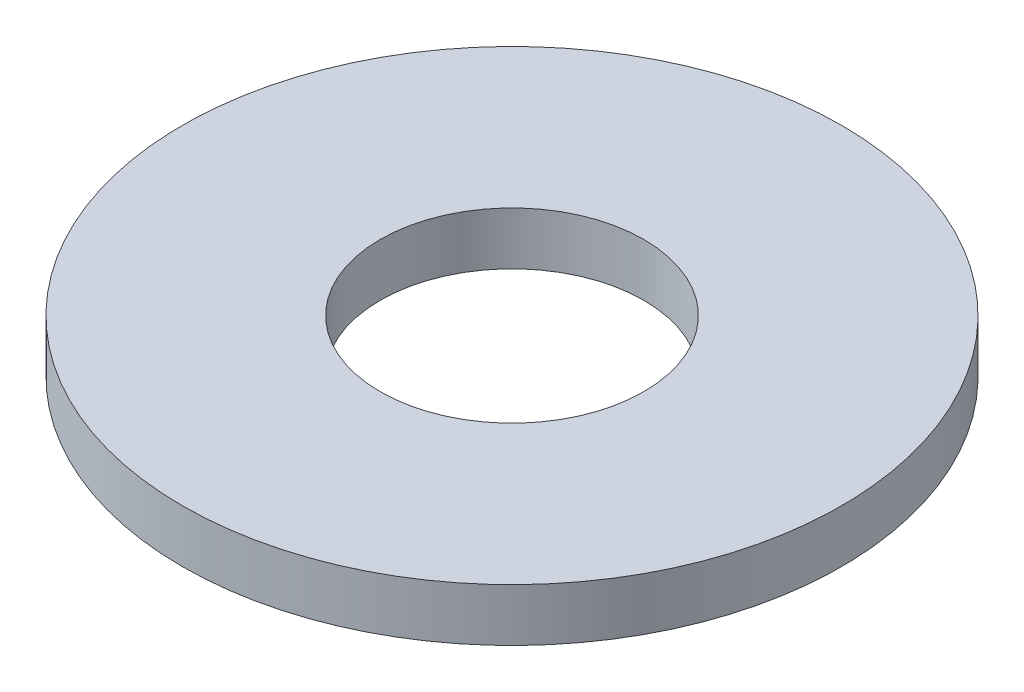
ISO-10303-21;
HEADER;
FILE_DESCRIPTION(('STEP AP214'),'2;1');
FILE_NAME('part.step','',(''),(''),'','','');
FILE_SCHEMA(('AUTOMOTIVE_DESIGN { 1 0 10303 214 1 1 1 1 }'));
ENDSEC;
DATA;
#1=APPLICATION_CONTEXT('core data for automotive mechanical design processes');
#2=APPLICATION_PROTOCOL_DEFINITION('international standard','automotive_design',2000,#1);
#3=PRODUCT_CONTEXT('',#1,'mechanical');
#4=PRODUCT('Part','Part','',(#3));
#5=PRODUCT_RELATED_PRODUCT_CATEGORY('part','',(#4));
#6=PRODUCT_DEFINITION_FORMATION('','',#4);
#7=PRODUCT_DEFINITION_CONTEXT('part definition',#1,'design');
#8=PRODUCT_DEFINITION('design','',#6,#7);
#9=PRODUCT_DEFINITION_SHAPE('','',#8);
#10=(LENGTH_UNIT() NAMED_UNIT(*) SI_UNIT(.MILLI.,.METRE.));
#11=(NAMED_UNIT(*) PLANE_ANGLE_UNIT() SI_UNIT($,.RADIAN.));
#12=(NAMED_UNIT(*) SI_UNIT($,.STERADIAN.) SOLID_ANGLE_UNIT());
#13=UNCERTAINTY_MEASURE_WITH_UNIT(LENGTH_MEASURE(1.E-05),#10,'distance_accuracy_value','');
#14=(GEOMETRIC_REPRESENTATION_CONTEXT(3) GLOBAL_UNCERTAINTY_ASSIGNED_CONTEXT((#13)) GLOBAL_UNIT_ASSIGNED_CONTEXT((#10,
#11,#12)) REPRESENTATION_CONTEXT('',''));
#15=CARTESIAN_POINT('',(0.,0.,0.));
#16=DIRECTION('',(0.,0.,1.));
#17=DIRECTION('',(1.,0.,0.));
#18=AXIS2_PLACEMENT_3D('',#15,#16,#17);
#19=CARTESIAN_POINT('',(0.,0.399999999999998,0.));
#20=DIRECTION('',(0.,1.,0.));
#21=DIRECTION('',(0.,0.,1.));
#22=AXIS2_PLACEMENT_3D('',#19,#20,#21);
#23=PLANE('',#22);
#24=CARTESIAN_POINT('',(0.,0.399999999999998,0.));
#25=DIRECTION('',(0.,1.,0.));
#26=DIRECTION('',(0.,0.,1.));
#27=AXIS2_PLACEMENT_3D('',#24,#25,#26);
#28=CIRCLE('',#27,5.);
#29=CARTESIAN_POINT('',(0.,0.399999999999998,5.));
#30=VERTEX_POINT('',#29);
#31=EDGE_CURVE('E10',#30,#30,#28,.T.);
#32=ORIENTED_EDGE('',*,*,#31,.T.);
#33=EDGE_LOOP('',(#32));
#34=FACE_BOUND('',#33,.T.);
#35=CARTESIAN_POINT('',(0.,0.399999999999998,0.));
#36=DIRECTION('',(0.,1.,0.));
#37=DIRECTION('',(0.,0.,1.));
#38=AXIS2_PLACEMENT_3D('',#35,#36,#37);
#39=CIRCLE('',#38,2.);
#40=CARTESIAN_POINT('',(0.,0.399999999999998,2.));
#41=VERTEX_POINT('',#40);
#42=EDGE_CURVE('E39',#41,#41,#39,.T.);
#43=ORIENTED_EDGE('',*,*,#42,.F.);
#44=EDGE_LOOP('',(#43));
#45=FACE_BOUND('',#44,.T.);
#46=ADVANCED_FACE('F28',(#34,#45),#23,.T.);
#47=CARTESIAN_POINT('',(0.,-0.399999999999998,0.));
#48=DIRECTION('',(0.,1.,0.));
#49=DIRECTION('',(0.,0.,1.));
#50=AXIS2_PLACEMENT_3D('',#47,#48,#49);
#51=PLANE('',#50);
#52=CARTESIAN_POINT('',(0.,-0.399999999999998,0.));
#53=DIRECTION('',(0.,1.,0.));
#54=DIRECTION('',(0.,0.,1.));
#55=AXIS2_PLACEMENT_3D('',#52,#53,#54);
#56=CIRCLE('',#55,5.);
#57=CARTESIAN_POINT('',(0.,-0.399999999999998,5.));
#58=VERTEX_POINT('',#57);
#59=EDGE_CURVE('E32',#58,#58,#56,.T.);
#60=ORIENTED_EDGE('',*,*,#59,.F.);
#61=EDGE_LOOP('',(#60));
#62=FACE_BOUND('',#61,.T.);
#63=CARTESIAN_POINT('',(0.,-0.399999999999998,0.));
#64=DIRECTION('',(0.,1.,0.));
#65=DIRECTION('',(0.,0.,1.));
#66=AXIS2_PLACEMENT_3D('',#63,#64,#65);
#67=CIRCLE('',#66,2.);
#68=CARTESIAN_POINT('',(0.,-0.399999999999998,2.));
#69=VERTEX_POINT('',#68);
#70=EDGE_CURVE('E41',#69,#69,#67,.T.);
#71=ORIENTED_EDGE('',*,*,#70,.T.);
#72=EDGE_LOOP('',(#71));
#73=FACE_BOUND('',#72,.T.);
#74=ADVANCED_FACE('F51',(#62,#73),#51,.F.);
#75=CARTESIAN_POINT('',(0.,0.399999999999998,0.));
#76=DIRECTION('',(0.,-1.,0.));
#77=DIRECTION('',(0.,0.,-1.));
#78=AXIS2_PLACEMENT_3D('',#75,#76,#77);
#79=CYLINDRICAL_SURFACE('',#78,5.);
#80=ORIENTED_EDGE('',*,*,#31,.F.);
#81=EDGE_LOOP('',(#80));
#82=FACE_BOUND('',#81,.T.);
#83=ORIENTED_EDGE('',*,*,#59,.T.);
#84=EDGE_LOOP('',(#83));
#85=FACE_BOUND('',#84,.T.);
#86=ADVANCED_FACE('F30',(#82,#85),#79,.T.);
#87=CARTESIAN_POINT('',(0.,0.399999999999998,0.));
#88=DIRECTION('',(0.,-1.,0.));
#89=DIRECTION('',(0.,0.,-1.));
#90=AXIS2_PLACEMENT_3D('',#87,#88,#89);
#91=CYLINDRICAL_SURFACE('',#90,2.);
#92=ORIENTED_EDGE('',*,*,#42,.T.);
#93=EDGE_LOOP('',(#92));
#94=FACE_BOUND('',#93,.T.);
#95=ORIENTED_EDGE('',*,*,#70,.F.);
#96=EDGE_LOOP('',(#95));
#97=FACE_BOUND('',#96,.T.);
#98=ADVANCED_FACE('F47',(#94,#97),#91,.F.);
#99=CLOSED_SHELL('',(#46,#74,#86,#98));
#100=MANIFOLD_SOLID_BREP('B2',#99);
#101=ADVANCED_BREP_SHAPE_REPRESENTATION('',(#18,#100),#14);
#102=SHAPE_DEFINITION_REPRESENTATION(#9,#101);
ENDSEC;
END-ISO-10303-21;
